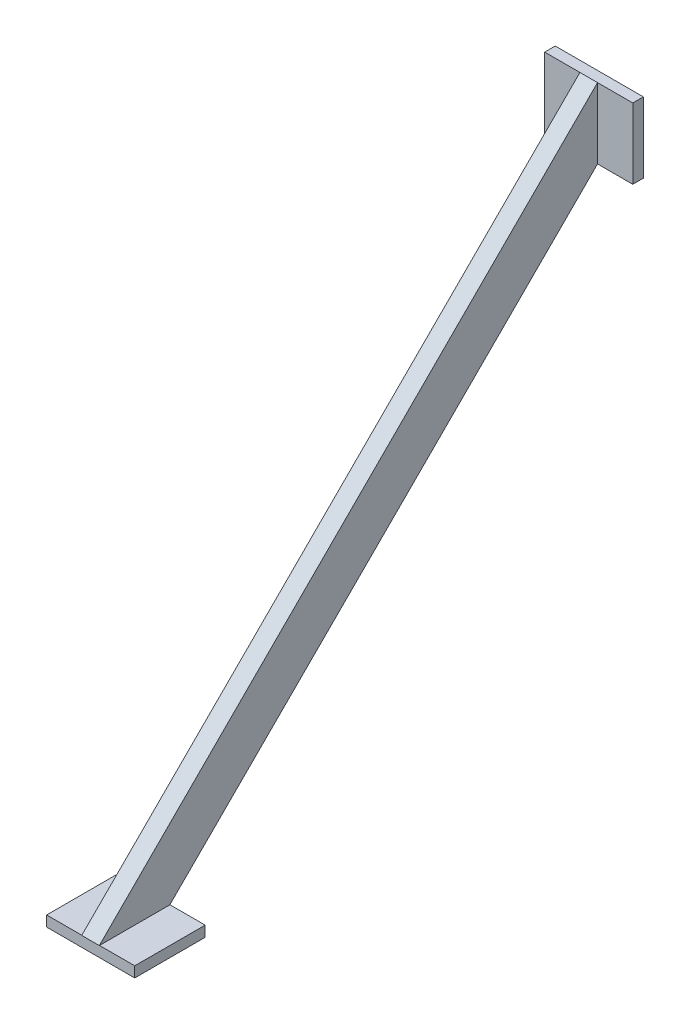
ISO-10303-21;
HEADER;
FILE_DESCRIPTION(('STEP AP214'),'2;1');
FILE_NAME('part.step','',(''),(''),'','','');
FILE_SCHEMA(('AUTOMOTIVE_DESIGN { 1 0 10303 214 1 1 1 1 }'));
ENDSEC;
DATA;
#1=APPLICATION_CONTEXT('core data for automotive mechanical design processes');
#2=APPLICATION_PROTOCOL_DEFINITION('international standard','automotive_design',2000,#1);
#3=PRODUCT_CONTEXT('',#1,'mechanical');
#4=PRODUCT('Part','Part','',(#3));
#5=PRODUCT_RELATED_PRODUCT_CATEGORY('part','',(#4));
#6=PRODUCT_DEFINITION_FORMATION('','',#4);
#7=PRODUCT_DEFINITION_CONTEXT('part definition',#1,'design');
#8=PRODUCT_DEFINITION('design','',#6,#7);
#9=PRODUCT_DEFINITION_SHAPE('','',#8);
#10=(LENGTH_UNIT() NAMED_UNIT(*) SI_UNIT(.MILLI.,.METRE.));
#11=(NAMED_UNIT(*) PLANE_ANGLE_UNIT() SI_UNIT($,.RADIAN.));
#12=(NAMED_UNIT(*) SI_UNIT($,.STERADIAN.) SOLID_ANGLE_UNIT());
#13=UNCERTAINTY_MEASURE_WITH_UNIT(LENGTH_MEASURE(1.E-05),#10,'distance_accuracy_value','');
#14=(GEOMETRIC_REPRESENTATION_CONTEXT(3) GLOBAL_UNCERTAINTY_ASSIGNED_CONTEXT((#13)) GLOBAL_UNIT_ASSIGNED_CONTEXT((#10,
#11,#12)) REPRESENTATION_CONTEXT('',''));
#15=CARTESIAN_POINT('',(0.,0.,0.));
#16=DIRECTION('',(0.,0.,1.));
#17=DIRECTION('',(1.,0.,0.));
#18=AXIS2_PLACEMENT_3D('',#15,#16,#17);
#19=CARTESIAN_POINT('',(5.,-26.9092582462666,34.7566900060172));
#20=DIRECTION('',(0.,1.,0.));
#21=DIRECTION('',(0.,0.,1.));
#22=AXIS2_PLACEMENT_3D('',#19,#20,#21);
#23=PLANE('',#22);
#24=DIRECTION('',(-1.,0.,0.));
#25=VECTOR('',#24,1.);
#26=CARTESIAN_POINT('',(15.,-26.9092582462666,34.7032841826592));
#27=LINE('',#26,#25);
#28=CARTESIAN_POINT('',(5.,-26.9092582462666,34.7032841826592));
#29=VERTEX_POINT('',#28);
#30=CARTESIAN_POINT('',(0.,-26.9092582462666,34.7032841826592));
#31=VERTEX_POINT('',#30);
#32=EDGE_CURVE('E11',#29,#31,#27,.T.);
#33=ORIENTED_EDGE('',*,*,#32,.F.);
#34=DIRECTION('',(0.,0.,-1.));
#35=VECTOR('',#34,1.);
#36=CARTESIAN_POINT('',(5.,-26.9092582462666,34.7566900060172));
#37=LINE('',#36,#35);
#38=CARTESIAN_POINT('',(5.,-26.9092582462666,34.7566900060172));
#39=VERTEX_POINT('',#38);
#40=EDGE_CURVE('E230',#39,#29,#37,.T.);
#41=ORIENTED_EDGE('',*,*,#40,.F.);
#42=DIRECTION('',(-1.,0.,0.));
#43=VECTOR('',#42,1.);
#44=CARTESIAN_POINT('',(5.,-26.9092582462666,34.7566900060172));
#45=LINE('',#44,#43);
#46=CARTESIAN_POINT('',(0.,-26.9092582462666,34.7566900060172));
#47=VERTEX_POINT('',#46);
#48=EDGE_CURVE('E252',#39,#47,#45,.T.);
#49=ORIENTED_EDGE('',*,*,#48,.T.);
#50=DIRECTION('',(0.,0.,-1.));
#51=VECTOR('',#50,1.);
#52=CARTESIAN_POINT('',(0.,-26.9092582462666,34.7566900060172));
#53=LINE('',#52,#51);
#54=EDGE_CURVE('E243',#47,#31,#53,.T.);
#55=ORIENTED_EDGE('',*,*,#54,.T.);
#56=EDGE_LOOP('',(#33,#41,#49,#55));
#57=FACE_BOUND('',#56,.T.);
#58=ADVANCED_FACE('F39',(#57),#23,.F.);
#59=CARTESIAN_POINT('',(5.,114.512097991043,-106.664666231292));
#60=DIRECTION('',(0.,-0.707106781186547,-0.707106781186548));
#61=DIRECTION('',(0.,0.707106781186548,-0.707106781186547));
#62=AXIS2_PLACEMENT_3D('',#59,#60,#61);
#63=PLANE('',#62);
#64=DIRECTION('',(0.,-0.707106781186548,0.707106781186547));
#65=VECTOR('',#64,1.);
#66=CARTESIAN_POINT('',(0.,114.512097991043,-106.664666231292));
#67=LINE('',#66,#65);
#68=CARTESIAN_POINT('',(0.,114.512097991043,-106.664666231292));
#69=VERTEX_POINT('',#68);
#70=EDGE_CURVE('E239',#69,#47,#67,.T.);
#71=ORIENTED_EDGE('',*,*,#70,.T.);
#72=ORIENTED_EDGE('',*,*,#48,.F.);
#73=DIRECTION('',(0.,-0.707106781186548,0.707106781186547));
#74=VECTOR('',#73,1.);
#75=CARTESIAN_POINT('',(5.,114.512097991043,-106.664666231292));
#76=LINE('',#75,#74);
#77=CARTESIAN_POINT('',(5.,114.512097991043,-106.664666231292));
#78=VERTEX_POINT('',#77);
#79=EDGE_CURVE('E226',#78,#39,#76,.T.);
#80=ORIENTED_EDGE('',*,*,#79,.F.);
#81=DIRECTION('',(-1.,0.,0.));
#82=VECTOR('',#81,1.);
#83=CARTESIAN_POINT('',(5.,114.512097991043,-106.664666231292));
#84=LINE('',#83,#82);
#85=EDGE_CURVE('E43',#78,#69,#84,.T.);
#86=ORIENTED_EDGE('',*,*,#85,.T.);
#87=EDGE_LOOP('',(#71,#72,#80,#86));
#88=FACE_BOUND('',#87,.T.);
#89=ADVANCED_FACE('F41',(#88),#63,.F.);
#90=CARTESIAN_POINT('',(5.,-26.9092582462666,14.7566900060171));
#91=DIRECTION('',(0.,0.707106781186547,0.707106781186548));
#92=DIRECTION('',(0.,-0.707106781186548,0.707106781186547));
#93=AXIS2_PLACEMENT_3D('',#90,#91,#92);
#94=PLANE('',#93);
#95=DIRECTION('',(0.,0.707106781186548,-0.707106781186547));
#96=VECTOR('',#95,1.);
#97=CARTESIAN_POINT('',(0.,-26.9092582462666,14.7566900060171));
#98=LINE('',#97,#96);
#99=CARTESIAN_POINT('',(0.,-26.9092582462666,14.7566900060171));
#100=VERTEX_POINT('',#99);
#101=CARTESIAN_POINT('',(0.,94.5120979910429,-106.664666231292));
#102=VERTEX_POINT('',#101);
#103=EDGE_CURVE('E227',#100,#102,#98,.T.);
#104=ORIENTED_EDGE('',*,*,#103,.T.);
#105=DIRECTION('',(-1.,0.,0.));
#106=VECTOR('',#105,1.);
#107=CARTESIAN_POINT('',(5.,94.5120979910429,-106.664666231292));
#108=LINE('',#107,#106);
#109=CARTESIAN_POINT('',(5.,94.5120979910429,-106.664666231292));
#110=VERTEX_POINT('',#109);
#111=EDGE_CURVE('E236',#110,#102,#108,.T.);
#112=ORIENTED_EDGE('',*,*,#111,.F.);
#113=DIRECTION('',(0.,0.707106781186548,-0.707106781186547));
#114=VECTOR('',#113,1.);
#115=CARTESIAN_POINT('',(5.,-26.9092582462666,14.7566900060171));
#116=LINE('',#115,#114);
#117=CARTESIAN_POINT('',(5.,-26.9092582462666,14.7566900060171));
#118=VERTEX_POINT('',#117);
#119=EDGE_CURVE('E233',#118,#110,#116,.T.);
#120=ORIENTED_EDGE('',*,*,#119,.F.);
#121=DIRECTION('',(-1.,0.,0.));
#122=VECTOR('',#121,1.);
#123=CARTESIAN_POINT('',(5.,-26.9092582462666,14.7566900060171));
#124=LINE('',#123,#122);
#125=EDGE_CURVE('E79',#118,#100,#124,.T.);
#126=ORIENTED_EDGE('',*,*,#125,.T.);
#127=EDGE_LOOP('',(#104,#112,#120,#126));
#128=FACE_BOUND('',#127,.T.);
#129=ADVANCED_FACE('F308',(#128),#94,.F.);
#130=CARTESIAN_POINT('',(5.,0.,0.));
#131=DIRECTION('',(-1.,0.,0.));
#132=DIRECTION('',(0.,0.,1.));
#133=AXIS2_PLACEMENT_3D('',#130,#131,#132);
#134=PLANE('',#133);
#135=DIRECTION('',(0.,1.,0.));
#136=VECTOR('',#135,1.);
#137=CARTESIAN_POINT('',(5.,94.5120979910429,-106.664666231292));
#138=LINE('',#137,#136);
#139=EDGE_CURVE('E222',#110,#78,#138,.T.);
#140=ORIENTED_EDGE('',*,*,#139,.T.);
#141=ORIENTED_EDGE('',*,*,#79,.T.);
#142=ORIENTED_EDGE('',*,*,#40,.T.);
#143=EDGE_CURVE('E64',#29,#118,#37,.T.);
#144=ORIENTED_EDGE('',*,*,#143,.T.);
#145=ORIENTED_EDGE('',*,*,#119,.T.);
#146=EDGE_LOOP('',(#140,#141,#142,#144,#145));
#147=FACE_BOUND('',#146,.T.);
#148=ADVANCED_FACE('F261',(#147),#134,.F.);
#149=CARTESIAN_POINT('',(0.,0.,0.));
#150=DIRECTION('',(-1.,0.,0.));
#151=DIRECTION('',(0.,0.,1.));
#152=AXIS2_PLACEMENT_3D('',#149,#150,#151);
#153=PLANE('',#152);
#154=DIRECTION('',(0.,1.,0.));
#155=VECTOR('',#154,1.);
#156=CARTESIAN_POINT('',(0.,94.5120979910429,-106.664666231292));
#157=LINE('',#156,#155);
#158=EDGE_CURVE('E221',#102,#69,#157,.T.);
#159=ORIENTED_EDGE('',*,*,#158,.F.);
#160=ORIENTED_EDGE('',*,*,#103,.F.);
#161=EDGE_CURVE('E242',#31,#100,#53,.T.);
#162=ORIENTED_EDGE('',*,*,#161,.F.);
#163=ORIENTED_EDGE('',*,*,#54,.F.);
#164=ORIENTED_EDGE('',*,*,#70,.F.);
#165=EDGE_LOOP('',(#159,#160,#162,#163,#164));
#166=FACE_BOUND('',#165,.T.);
#167=ADVANCED_FACE('F300',(#166),#153,.T.);
#168=CARTESIAN_POINT('',(15.,-29.9092582462666,34.7032841826592));
#169=DIRECTION('',(-1.,0.,0.));
#170=DIRECTION('',(0.,0.,1.));
#171=AXIS2_PLACEMENT_3D('',#168,#169,#170);
#172=PLANE('',#171);
#173=DIRECTION('',(0.,0.,1.));
#174=VECTOR('',#173,1.);
#175=CARTESIAN_POINT('',(15.,-26.9092582462666,34.7032841826592));
#176=LINE('',#175,#174);
#177=CARTESIAN_POINT('',(15.,-26.9092582462666,14.7032841826592));
#178=VERTEX_POINT('',#177);
#179=CARTESIAN_POINT('',(15.,-26.9092582462666,34.7032841826592));
#180=VERTEX_POINT('',#179);
#181=EDGE_CURVE('E174',#178,#180,#176,.T.);
#182=ORIENTED_EDGE('',*,*,#181,.T.);
#183=DIRECTION('',(0.,1.,0.));
#184=VECTOR('',#183,1.);
#185=CARTESIAN_POINT('',(15.,-29.9092582462666,34.7032841826592));
#186=LINE('',#185,#184);
#187=CARTESIAN_POINT('',(15.,-29.9092582462666,34.7032841826592));
#188=VERTEX_POINT('',#187);
#189=EDGE_CURVE('E217',#188,#180,#186,.T.);
#190=ORIENTED_EDGE('',*,*,#189,.F.);
#191=DIRECTION('',(0.,0.,1.));
#192=VECTOR('',#191,1.);
#193=CARTESIAN_POINT('',(15.,-29.9092582462666,34.7032841826592));
#194=LINE('',#193,#192);
#195=CARTESIAN_POINT('',(15.,-29.9092582462666,14.7032841826592));
#196=VERTEX_POINT('',#195);
#197=EDGE_CURVE('E184',#196,#188,#194,.T.);
#198=ORIENTED_EDGE('',*,*,#197,.F.);
#199=DIRECTION('',(0.,1.,0.));
#200=VECTOR('',#199,1.);
#201=CARTESIAN_POINT('',(15.,-29.9092582462666,14.7032841826592));
#202=LINE('',#201,#200);
#203=EDGE_CURVE('E197',#196,#178,#202,.T.);
#204=ORIENTED_EDGE('',*,*,#203,.T.);
#205=EDGE_LOOP('',(#182,#190,#198,#204));
#206=FACE_BOUND('',#205,.T.);
#207=ADVANCED_FACE('F314',(#206),#172,.F.);
#208=CARTESIAN_POINT('',(15.,-29.9092582462666,34.7032841826592));
#209=DIRECTION('',(0.,0.,-1.));
#210=DIRECTION('',(-1.,0.,0.));
#211=AXIS2_PLACEMENT_3D('',#208,#209,#210);
#212=PLANE('',#211);
#213=EDGE_CURVE('E50',#180,#29,#27,.T.);
#214=ORIENTED_EDGE('',*,*,#213,.T.);
#215=ORIENTED_EDGE('',*,*,#32,.T.);
#216=CARTESIAN_POINT('',(-10.,-26.9092582462666,34.7032841826592));
#217=VERTEX_POINT('',#216);
#218=EDGE_CURVE('E51',#31,#217,#27,.T.);
#219=ORIENTED_EDGE('',*,*,#218,.T.);
#220=DIRECTION('',(0.,1.,0.));
#221=VECTOR('',#220,1.);
#222=CARTESIAN_POINT('',(-10.,-29.9092582462666,34.7032841826592));
#223=LINE('',#222,#221);
#224=CARTESIAN_POINT('',(-10.,-29.9092582462666,34.7032841826592));
#225=VERTEX_POINT('',#224);
#226=EDGE_CURVE('E213',#225,#217,#223,.T.);
#227=ORIENTED_EDGE('',*,*,#226,.F.);
#228=DIRECTION('',(-1.,0.,0.));
#229=VECTOR('',#228,1.);
#230=CARTESIAN_POINT('',(15.,-29.9092582462666,34.7032841826592));
#231=LINE('',#230,#229);
#232=EDGE_CURVE('E188',#188,#225,#231,.T.);
#233=ORIENTED_EDGE('',*,*,#232,.F.);
#234=ORIENTED_EDGE('',*,*,#189,.T.);
#235=EDGE_LOOP('',(#214,#215,#219,#227,#233,#234));
#236=FACE_BOUND('',#235,.T.);
#237=ADVANCED_FACE('F319',(#236),#212,.F.);
#238=CARTESIAN_POINT('',(-10.,-29.9092582462666,34.7032841826592));
#239=DIRECTION('',(1.,0.,0.));
#240=DIRECTION('',(0.,0.,-1.));
#241=AXIS2_PLACEMENT_3D('',#238,#239,#240);
#242=PLANE('',#241);
#243=DIRECTION('',(0.,0.,-1.));
#244=VECTOR('',#243,1.);
#245=CARTESIAN_POINT('',(-10.,-26.9092582462666,34.7032841826592));
#246=LINE('',#245,#244);
#247=CARTESIAN_POINT('',(-10.,-26.9092582462666,14.7032841826592));
#248=VERTEX_POINT('',#247);
#249=EDGE_CURVE('E201',#217,#248,#246,.T.);
#250=ORIENTED_EDGE('',*,*,#249,.T.);
#251=DIRECTION('',(0.,1.,0.));
#252=VECTOR('',#251,1.);
#253=CARTESIAN_POINT('',(-10.,-29.9092582462666,14.7032841826592));
#254=LINE('',#253,#252);
#255=CARTESIAN_POINT('',(-10.,-29.9092582462666,14.7032841826592));
#256=VERTEX_POINT('',#255);
#257=EDGE_CURVE('E209',#256,#248,#254,.T.);
#258=ORIENTED_EDGE('',*,*,#257,.F.);
#259=DIRECTION('',(0.,0.,-1.));
#260=VECTOR('',#259,1.);
#261=CARTESIAN_POINT('',(-10.,-29.9092582462666,34.7032841826592));
#262=LINE('',#261,#260);
#263=EDGE_CURVE('E192',#225,#256,#262,.T.);
#264=ORIENTED_EDGE('',*,*,#263,.F.);
#265=ORIENTED_EDGE('',*,*,#226,.T.);
#266=EDGE_LOOP('',(#250,#258,#264,#265));
#267=FACE_BOUND('',#266,.T.);
#268=ADVANCED_FACE('F323',(#267),#242,.F.);
#269=CARTESIAN_POINT('',(15.,-29.9092582462666,14.7032841826592));
#270=DIRECTION('',(0.,0.,1.));
#271=DIRECTION('',(1.,0.,0.));
#272=AXIS2_PLACEMENT_3D('',#269,#270,#271);
#273=PLANE('',#272);
#274=DIRECTION('',(1.,0.,0.));
#275=VECTOR('',#274,1.);
#276=CARTESIAN_POINT('',(15.,-26.9092582462666,14.7032841826592));
#277=LINE('',#276,#275);
#278=EDGE_CURVE('E189',#248,#178,#277,.T.);
#279=ORIENTED_EDGE('',*,*,#278,.T.);
#280=ORIENTED_EDGE('',*,*,#203,.F.);
#281=DIRECTION('',(1.,0.,0.));
#282=VECTOR('',#281,1.);
#283=CARTESIAN_POINT('',(15.,-29.9092582462666,14.7032841826592));
#284=LINE('',#283,#282);
#285=EDGE_CURVE('E195',#256,#196,#284,.T.);
#286=ORIENTED_EDGE('',*,*,#285,.F.);
#287=ORIENTED_EDGE('',*,*,#257,.T.);
#288=EDGE_LOOP('',(#279,#280,#286,#287));
#289=FACE_BOUND('',#288,.T.);
#290=ADVANCED_FACE('F327',(#289),#273,.F.);
#291=CARTESIAN_POINT('',(0.,-29.9092582462666,0.));
#292=DIRECTION('',(0.,1.,0.));
#293=DIRECTION('',(0.,0.,1.));
#294=AXIS2_PLACEMENT_3D('',#291,#292,#293);
#295=PLANE('',#294);
#296=ORIENTED_EDGE('',*,*,#197,.T.);
#297=ORIENTED_EDGE('',*,*,#232,.T.);
#298=ORIENTED_EDGE('',*,*,#263,.T.);
#299=ORIENTED_EDGE('',*,*,#285,.T.);
#300=EDGE_LOOP('',(#296,#297,#298,#299));
#301=FACE_BOUND('',#300,.T.);
#302=ADVANCED_FACE('F331',(#301),#295,.F.);
#303=CARTESIAN_POINT('',(0.,-26.9092582462666,0.));
#304=DIRECTION('',(0.,1.,0.));
#305=DIRECTION('',(0.,0.,1.));
#306=AXIS2_PLACEMENT_3D('',#303,#304,#305);
#307=PLANE('',#306);
#308=ORIENTED_EDGE('',*,*,#218,.F.);
#309=ORIENTED_EDGE('',*,*,#161,.T.);
#310=ORIENTED_EDGE('',*,*,#125,.F.);
#311=ORIENTED_EDGE('',*,*,#143,.F.);
#312=ORIENTED_EDGE('',*,*,#213,.F.);
#313=ORIENTED_EDGE('',*,*,#181,.F.);
#314=ORIENTED_EDGE('',*,*,#278,.F.);
#315=ORIENTED_EDGE('',*,*,#249,.F.);
#316=EDGE_LOOP('',(#308,#309,#310,#311,#312,#313,#314,#315));
#317=FACE_BOUND('',#316,.T.);
#318=ADVANCED_FACE('F333',(#317),#307,.T.);
#319=CARTESIAN_POINT('',(0.,0.,-106.664666231292));
#320=DIRECTION('',(0.,0.,-1.));
#321=DIRECTION('',(0.,1.,0.));
#322=AXIS2_PLACEMENT_3D('',#319,#320,#321);
#323=PLANE('',#322);
#324=DIRECTION('',(-1.,0.,0.));
#325=VECTOR('',#324,1.);
#326=CARTESIAN_POINT('',(-8.72832764009801,94.5120979910429,-106.664666231292));
#327=LINE('',#326,#325);
#328=CARTESIAN_POINT('',(-9.99999999999999,94.5120979910429,-106.664666231292));
#329=VERTEX_POINT('',#328);
#330=EDGE_CURVE('E274',#102,#329,#327,.T.);
#331=ORIENTED_EDGE('',*,*,#330,.F.);
#332=ORIENTED_EDGE('',*,*,#158,.T.);
#333=DIRECTION('',(1.,0.,0.));
#334=VECTOR('',#333,1.);
#335=CARTESIAN_POINT('',(-9.99999999999999,114.512097991043,-106.664666231292));
#336=LINE('',#335,#334);
#337=CARTESIAN_POINT('',(-9.99999999999999,114.512097991043,-106.664666231292));
#338=VERTEX_POINT('',#337);
#339=EDGE_CURVE('E290',#338,#69,#336,.T.);
#340=ORIENTED_EDGE('',*,*,#339,.F.);
#341=DIRECTION('',(0.,1.,0.));
#342=VECTOR('',#341,1.);
#343=CARTESIAN_POINT('',(-9.99999999999999,114.512097991043,-106.664666231292));
#344=LINE('',#343,#342);
#345=EDGE_CURVE('E172',#329,#338,#344,.T.);
#346=ORIENTED_EDGE('',*,*,#345,.F.);
#347=EDGE_LOOP('',(#331,#332,#340,#346));
#348=FACE_BOUND('',#347,.T.);
#349=ADVANCED_FACE('F297',(#348),#323,.F.);
#350=CARTESIAN_POINT('',(-9.99999999999999,114.512097991043,-109.664666231292));
#351=DIRECTION('',(1.,0.,0.));
#352=DIRECTION('',(0.,0.,-1.));
#353=AXIS2_PLACEMENT_3D('',#350,#351,#352);
#354=PLANE('',#353);
#355=ORIENTED_EDGE('',*,*,#345,.T.);
#356=DIRECTION('',(0.,0.,1.));
#357=VECTOR('',#356,1.);
#358=CARTESIAN_POINT('',(-9.99999999999999,114.512097991043,-109.664666231292));
#359=LINE('',#358,#357);
#360=CARTESIAN_POINT('',(-9.99999999999999,114.512097991043,-109.664666231292));
#361=VERTEX_POINT('',#360);
#362=EDGE_CURVE('E150',#361,#338,#359,.T.);
#363=ORIENTED_EDGE('',*,*,#362,.F.);
#364=DIRECTION('',(0.,1.,0.));
#365=VECTOR('',#364,1.);
#366=CARTESIAN_POINT('',(-9.99999999999999,114.512097991043,-109.664666231292));
#367=LINE('',#366,#365);
#368=CARTESIAN_POINT('',(-9.99999999999999,94.5120979910429,-109.664666231292));
#369=VERTEX_POINT('',#368);
#370=EDGE_CURVE('E158',#369,#361,#367,.T.);
#371=ORIENTED_EDGE('',*,*,#370,.F.);
#372=DIRECTION('',(0.,0.,1.));
#373=VECTOR('',#372,1.);
#374=CARTESIAN_POINT('',(-9.99999999999999,94.5120979910429,-109.664666231292));
#375=LINE('',#374,#373);
#376=EDGE_CURVE('E281',#369,#329,#375,.T.);
#377=ORIENTED_EDGE('',*,*,#376,.T.);
#378=EDGE_LOOP('',(#355,#363,#371,#377));
#379=FACE_BOUND('',#378,.T.);
#380=ADVANCED_FACE('F170',(#379),#354,.F.);
#381=CARTESIAN_POINT('',(-9.99999999999999,114.512097991043,-109.664666231292));
#382=DIRECTION('',(0.,-1.,0.));
#383=DIRECTION('',(0.,0.,-1.));
#384=AXIS2_PLACEMENT_3D('',#381,#382,#383);
#385=PLANE('',#384);
#386=ORIENTED_EDGE('',*,*,#339,.T.);
#387=ORIENTED_EDGE('',*,*,#85,.F.);
#388=CARTESIAN_POINT('',(15.,114.512097991043,-106.664666231292));
#389=VERTEX_POINT('',#388);
#390=EDGE_CURVE('E268',#78,#389,#336,.T.);
#391=ORIENTED_EDGE('',*,*,#390,.T.);
#392=DIRECTION('',(0.,0.,1.));
#393=VECTOR('',#392,1.);
#394=CARTESIAN_POINT('',(15.,114.512097991043,-109.664666231292));
#395=LINE('',#394,#393);
#396=CARTESIAN_POINT('',(15.,114.512097991043,-109.664666231292));
#397=VERTEX_POINT('',#396);
#398=EDGE_CURVE('E153',#397,#389,#395,.T.);
#399=ORIENTED_EDGE('',*,*,#398,.F.);
#400=DIRECTION('',(1.,0.,0.));
#401=VECTOR('',#400,1.);
#402=CARTESIAN_POINT('',(-9.99999999999999,114.512097991043,-109.664666231292));
#403=LINE('',#402,#401);
#404=EDGE_CURVE('E146',#361,#397,#403,.T.);
#405=ORIENTED_EDGE('',*,*,#404,.F.);
#406=ORIENTED_EDGE('',*,*,#362,.T.);
#407=EDGE_LOOP('',(#386,#387,#391,#399,#405,#406));
#408=FACE_BOUND('',#407,.T.);
#409=ADVANCED_FACE('F148',(#408),#385,.F.);
#410=CARTESIAN_POINT('',(15.,114.512097991043,-109.664666231292));
#411=DIRECTION('',(-1.,0.,0.));
#412=DIRECTION('',(0.,-1.,0.));
#413=AXIS2_PLACEMENT_3D('',#410,#411,#412);
#414=PLANE('',#413);
#415=DIRECTION('',(0.,-1.,0.));
#416=VECTOR('',#415,1.);
#417=CARTESIAN_POINT('',(15.,114.512097991043,-106.664666231292));
#418=LINE('',#417,#416);
#419=CARTESIAN_POINT('',(15.,94.5120979910429,-106.664666231292));
#420=VERTEX_POINT('',#419);
#421=EDGE_CURVE('E277',#389,#420,#418,.T.);
#422=ORIENTED_EDGE('',*,*,#421,.T.);
#423=DIRECTION('',(0.,0.,1.));
#424=VECTOR('',#423,1.);
#425=CARTESIAN_POINT('',(15.,94.5120979910429,-109.664666231292));
#426=LINE('',#425,#424);
#427=CARTESIAN_POINT('',(15.,94.5120979910429,-109.664666231292));
#428=VERTEX_POINT('',#427);
#429=EDGE_CURVE('E180',#428,#420,#426,.T.);
#430=ORIENTED_EDGE('',*,*,#429,.F.);
#431=DIRECTION('',(0.,-1.,0.));
#432=VECTOR('',#431,1.);
#433=CARTESIAN_POINT('',(15.,114.512097991043,-109.664666231292));
#434=LINE('',#433,#432);
#435=EDGE_CURVE('E157',#397,#428,#434,.T.);
#436=ORIENTED_EDGE('',*,*,#435,.F.);
#437=ORIENTED_EDGE('',*,*,#398,.T.);
#438=EDGE_LOOP('',(#422,#430,#436,#437));
#439=FACE_BOUND('',#438,.T.);
#440=ADVANCED_FACE('F295',(#439),#414,.F.);
#441=CARTESIAN_POINT('',(-8.72832764009801,94.5120979910429,-109.664666231292));
#442=DIRECTION('',(0.,1.,0.));
#443=DIRECTION('',(0.,0.,1.));
#444=AXIS2_PLACEMENT_3D('',#441,#442,#443);
#445=PLANE('',#444);
#446=EDGE_CURVE('E168',#420,#110,#327,.T.);
#447=ORIENTED_EDGE('',*,*,#446,.T.);
#448=ORIENTED_EDGE('',*,*,#111,.T.);
#449=ORIENTED_EDGE('',*,*,#330,.T.);
#450=ORIENTED_EDGE('',*,*,#376,.F.);
#451=DIRECTION('',(-1.,0.,0.));
#452=VECTOR('',#451,1.);
#453=CARTESIAN_POINT('',(15.,94.5120979910429,-109.664666231292));
#454=LINE('',#453,#452);
#455=EDGE_CURVE('E163',#428,#369,#454,.T.);
#456=ORIENTED_EDGE('',*,*,#455,.F.);
#457=ORIENTED_EDGE('',*,*,#429,.T.);
#458=EDGE_LOOP('',(#447,#448,#449,#450,#456,#457));
#459=FACE_BOUND('',#458,.T.);
#460=ADVANCED_FACE('F271',(#459),#445,.F.);
#461=CARTESIAN_POINT('',(0.,0.,-109.664666231292));
#462=DIRECTION('',(0.,0.,-1.));
#463=DIRECTION('',(0.,1.,0.));
#464=AXIS2_PLACEMENT_3D('',#461,#462,#463);
#465=PLANE('',#464);
#466=ORIENTED_EDGE('',*,*,#370,.T.);
#467=ORIENTED_EDGE('',*,*,#404,.T.);
#468=ORIENTED_EDGE('',*,*,#435,.T.);
#469=ORIENTED_EDGE('',*,*,#455,.T.);
#470=EDGE_LOOP('',(#466,#467,#468,#469));
#471=FACE_BOUND('',#470,.T.);
#472=ADVANCED_FACE('F161',(#471),#465,.T.);
#473=ORIENTED_EDGE('',*,*,#139,.F.);
#474=ORIENTED_EDGE('',*,*,#446,.F.);
#475=ORIENTED_EDGE('',*,*,#421,.F.);
#476=ORIENTED_EDGE('',*,*,#390,.F.);
#477=EDGE_LOOP('',(#473,#474,#475,#476));
#478=FACE_BOUND('',#477,.T.);
#479=ADVANCED_FACE('F265',(#478),#323,.F.);
#480=CLOSED_SHELL('',(#58,#89,#129,#148,#167,#207,#237,#268,#290,#302,#318,#349,#380,#409,#440,
#460,#472,#479));
#481=MANIFOLD_SOLID_BREP('B2',#480);
#482=ADVANCED_BREP_SHAPE_REPRESENTATION('',(#18,#481),#14);
#483=SHAPE_DEFINITION_REPRESENTATION(#9,#482);
ENDSEC;
END-ISO-10303-21;
